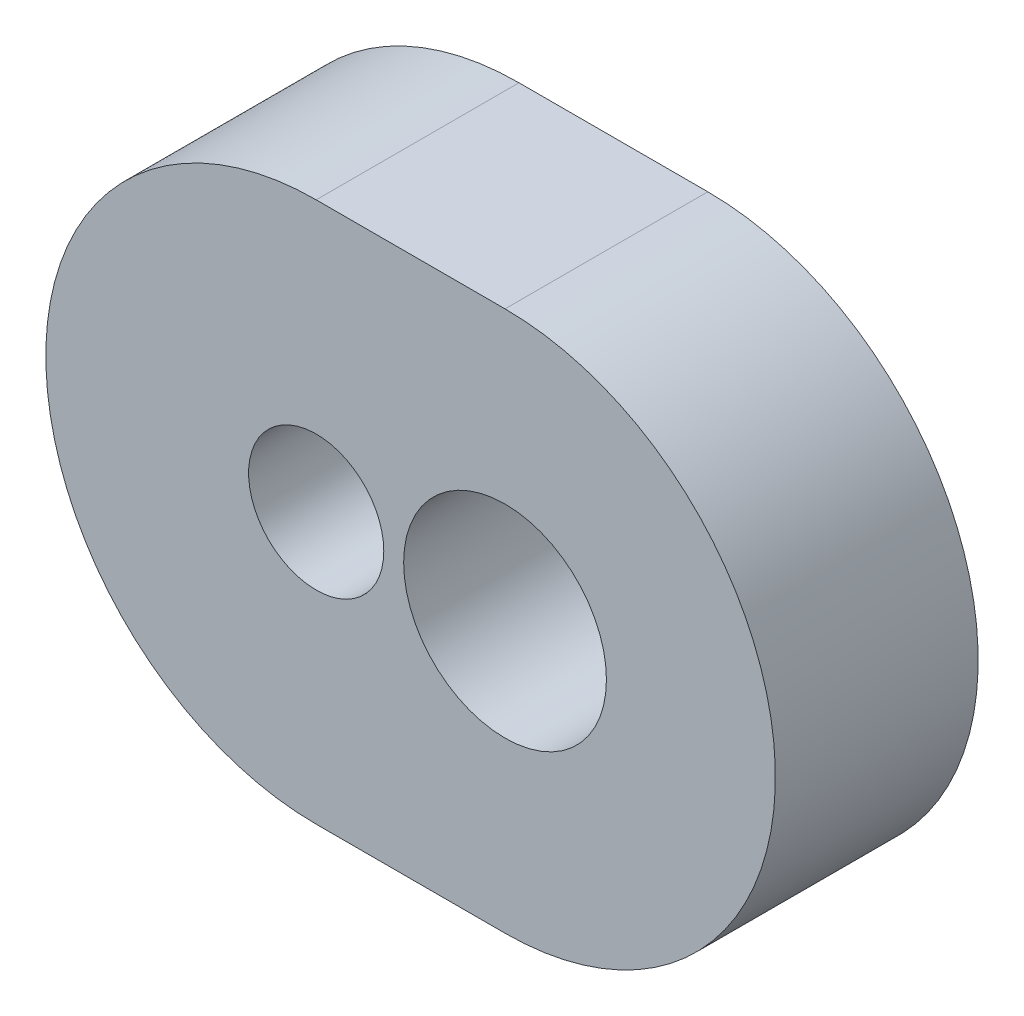
ISO-10303-21;
HEADER;
FILE_DESCRIPTION(('STEP AP214'),'2;1');
FILE_NAME('part.step','',(''),(''),'','','');
FILE_SCHEMA(('AUTOMOTIVE_DESIGN { 1 0 10303 214 1 1 1 1 }'));
ENDSEC;
DATA;
#1=APPLICATION_CONTEXT('core data for automotive mechanical design processes');
#2=APPLICATION_PROTOCOL_DEFINITION('international standard','automotive_design',2000,#1);
#3=PRODUCT_CONTEXT('',#1,'mechanical');
#4=PRODUCT('Part','Part','',(#3));
#5=PRODUCT_RELATED_PRODUCT_CATEGORY('part','',(#4));
#6=PRODUCT_DEFINITION_FORMATION('','',#4);
#7=PRODUCT_DEFINITION_CONTEXT('part definition',#1,'design');
#8=PRODUCT_DEFINITION('design','',#6,#7);
#9=PRODUCT_DEFINITION_SHAPE('','',#8);
#10=(LENGTH_UNIT() NAMED_UNIT(*) SI_UNIT(.MILLI.,.METRE.));
#11=(NAMED_UNIT(*) PLANE_ANGLE_UNIT() SI_UNIT($,.RADIAN.));
#12=(NAMED_UNIT(*) SI_UNIT($,.STERADIAN.) SOLID_ANGLE_UNIT());
#13=UNCERTAINTY_MEASURE_WITH_UNIT(LENGTH_MEASURE(1.E-05),#10,'distance_accuracy_value','');
#14=(GEOMETRIC_REPRESENTATION_CONTEXT(3) GLOBAL_UNCERTAINTY_ASSIGNED_CONTEXT((#13)) GLOBAL_UNIT_ASSIGNED_CONTEXT((#10,
#11,#12)) REPRESENTATION_CONTEXT('',''));
#15=CARTESIAN_POINT('',(0.,0.,0.));
#16=DIRECTION('',(0.,0.,1.));
#17=DIRECTION('',(1.,0.,0.));
#18=AXIS2_PLACEMENT_3D('',#15,#16,#17);
#19=CARTESIAN_POINT('',(0.,0.,3.));
#20=DIRECTION('',(0.,0.,-1.));
#21=DIRECTION('',(-1.,0.,0.));
#22=AXIS2_PLACEMENT_3D('',#19,#20,#21);
#23=PLANE('',#22);
#24=CARTESIAN_POINT('',(0.,0.,3.));
#25=DIRECTION('',(0.,0.,1.));
#26=DIRECTION('',(-1.,0.,0.));
#27=AXIS2_PLACEMENT_3D('',#24,#25,#26);
#28=CIRCLE('',#27,4.);
#29=CARTESIAN_POINT('',(0.,-4.,3.));
#30=VERTEX_POINT('',#29);
#31=CARTESIAN_POINT('',(0.,4.,3.));
#32=VERTEX_POINT('',#31);
#33=EDGE_CURVE('E93',#30,#32,#28,.T.);
#34=ORIENTED_EDGE('',*,*,#33,.T.);
#35=DIRECTION('',(-1.,0.,0.));
#36=VECTOR('',#35,1.);
#37=CARTESIAN_POINT('',(-2.794,4.,3.));
#38=LINE('',#37,#36);
#39=CARTESIAN_POINT('',(-2.794,4.,3.));
#40=VERTEX_POINT('',#39);
#41=EDGE_CURVE('E88',#32,#40,#38,.T.);
#42=ORIENTED_EDGE('',*,*,#41,.T.);
#43=CARTESIAN_POINT('',(-2.794,0.,3.));
#44=DIRECTION('',(0.,0.,1.));
#45=DIRECTION('',(1.,0.,0.));
#46=AXIS2_PLACEMENT_3D('',#43,#44,#45);
#47=CIRCLE('',#46,4.);
#48=CARTESIAN_POINT('',(-2.794,-4.,3.));
#49=VERTEX_POINT('',#48);
#50=EDGE_CURVE('E90',#40,#49,#47,.T.);
#51=ORIENTED_EDGE('',*,*,#50,.T.);
#52=DIRECTION('',(1.,0.,0.));
#53=VECTOR('',#52,1.);
#54=CARTESIAN_POINT('',(-2.794,-4.,3.));
#55=LINE('',#54,#53);
#56=EDGE_CURVE('E57',#49,#30,#55,.T.);
#57=ORIENTED_EDGE('',*,*,#56,.T.);
#58=EDGE_LOOP('',(#34,#42,#51,#57));
#59=FACE_BOUND('',#58,.T.);
#60=CARTESIAN_POINT('',(-2.794,0.,3.));
#61=DIRECTION('',(0.,0.,1.));
#62=DIRECTION('',(1.,0.,0.));
#63=AXIS2_PLACEMENT_3D('',#60,#61,#62);
#64=CIRCLE('',#63,1.);
#65=CARTESIAN_POINT('',(-1.794,0.,3.));
#66=VERTEX_POINT('',#65);
#67=EDGE_CURVE('E106',#66,#66,#64,.T.);
#68=ORIENTED_EDGE('',*,*,#67,.F.);
#69=EDGE_LOOP('',(#68));
#70=FACE_BOUND('',#69,.T.);
#71=CARTESIAN_POINT('',(0.,0.,3.));
#72=DIRECTION('',(0.,0.,1.));
#73=DIRECTION('',(1.,0.,0.));
#74=AXIS2_PLACEMENT_3D('',#71,#72,#73);
#75=CIRCLE('',#74,1.5);
#76=CARTESIAN_POINT('',(1.50000000000001,0.,3.));
#77=VERTEX_POINT('',#76);
#78=EDGE_CURVE('E123',#77,#77,#75,.T.);
#79=ORIENTED_EDGE('',*,*,#78,.F.);
#80=EDGE_LOOP('',(#79));
#81=FACE_BOUND('',#80,.T.);
#82=ADVANCED_FACE('F39',(#59,#70,#81),#23,.F.);
#83=CARTESIAN_POINT('',(0.,0.,0.));
#84=DIRECTION('',(0.,0.,-1.));
#85=DIRECTION('',(-1.,0.,0.));
#86=AXIS2_PLACEMENT_3D('',#83,#84,#85);
#87=PLANE('',#86);
#88=CARTESIAN_POINT('',(-2.794,0.,0.));
#89=DIRECTION('',(0.,0.,1.));
#90=DIRECTION('',(1.,0.,0.));
#91=AXIS2_PLACEMENT_3D('',#88,#89,#90);
#92=CIRCLE('',#91,1.);
#93=CARTESIAN_POINT('',(-1.794,0.,0.));
#94=VERTEX_POINT('',#93);
#95=EDGE_CURVE('E117',#94,#94,#92,.T.);
#96=ORIENTED_EDGE('',*,*,#95,.T.);
#97=EDGE_LOOP('',(#96));
#98=FACE_BOUND('',#97,.T.);
#99=CARTESIAN_POINT('',(0.,0.,0.));
#100=DIRECTION('',(0.,0.,1.));
#101=DIRECTION('',(-1.,0.,0.));
#102=AXIS2_PLACEMENT_3D('',#99,#100,#101);
#103=CIRCLE('',#102,4.);
#104=CARTESIAN_POINT('',(0.,-4.,0.));
#105=VERTEX_POINT('',#104);
#106=CARTESIAN_POINT('',(0.,4.,0.));
#107=VERTEX_POINT('',#106);
#108=EDGE_CURVE('E103',#105,#107,#103,.T.);
#109=ORIENTED_EDGE('',*,*,#108,.F.);
#110=DIRECTION('',(1.,0.,0.));
#111=VECTOR('',#110,1.);
#112=CARTESIAN_POINT('',(-2.794,-4.,0.));
#113=LINE('',#112,#111);
#114=CARTESIAN_POINT('',(-2.794,-4.,0.));
#115=VERTEX_POINT('',#114);
#116=EDGE_CURVE('E80',#115,#105,#113,.T.);
#117=ORIENTED_EDGE('',*,*,#116,.F.);
#118=CARTESIAN_POINT('',(-2.794,0.,0.));
#119=DIRECTION('',(0.,0.,1.));
#120=DIRECTION('',(1.,0.,0.));
#121=AXIS2_PLACEMENT_3D('',#118,#119,#120);
#122=CIRCLE('',#121,4.);
#123=CARTESIAN_POINT('',(-2.794,4.,0.));
#124=VERTEX_POINT('',#123);
#125=EDGE_CURVE('E71',#124,#115,#122,.T.);
#126=ORIENTED_EDGE('',*,*,#125,.F.);
#127=DIRECTION('',(-1.,0.,0.));
#128=VECTOR('',#127,1.);
#129=CARTESIAN_POINT('',(-2.794,4.,0.));
#130=LINE('',#129,#128);
#131=EDGE_CURVE('E92',#107,#124,#130,.T.);
#132=ORIENTED_EDGE('',*,*,#131,.F.);
#133=EDGE_LOOP('',(#109,#117,#126,#132));
#134=FACE_BOUND('',#133,.T.);
#135=CARTESIAN_POINT('',(0.,0.,0.));
#136=DIRECTION('',(0.,0.,1.));
#137=DIRECTION('',(1.,0.,0.));
#138=AXIS2_PLACEMENT_3D('',#135,#136,#137);
#139=CIRCLE('',#138,1.5);
#140=CARTESIAN_POINT('',(1.50000000000001,0.,0.));
#141=VERTEX_POINT('',#140);
#142=EDGE_CURVE('E122',#141,#141,#139,.T.);
#143=ORIENTED_EDGE('',*,*,#142,.T.);
#144=EDGE_LOOP('',(#143));
#145=FACE_BOUND('',#144,.T.);
#146=ADVANCED_FACE('F111',(#98,#134,#145),#87,.T.);
#147=CARTESIAN_POINT('',(0.,0.,3.));
#148=DIRECTION('',(0.,0.,-1.));
#149=DIRECTION('',(-1.,0.,0.));
#150=AXIS2_PLACEMENT_3D('',#147,#148,#149);
#151=CYLINDRICAL_SURFACE('',#150,4.);
#152=ORIENTED_EDGE('',*,*,#108,.T.);
#153=DIRECTION('',(0.,0.,-1.));
#154=VECTOR('',#153,1.);
#155=CARTESIAN_POINT('',(0.,4.,3.));
#156=LINE('',#155,#154);
#157=EDGE_CURVE('E11',#32,#107,#156,.T.);
#158=ORIENTED_EDGE('',*,*,#157,.F.);
#159=ORIENTED_EDGE('',*,*,#33,.F.);
#160=DIRECTION('',(0.,0.,-1.));
#161=VECTOR('',#160,1.);
#162=CARTESIAN_POINT('',(0.,-4.,3.));
#163=LINE('',#162,#161);
#164=EDGE_CURVE('E97',#30,#105,#163,.T.);
#165=ORIENTED_EDGE('',*,*,#164,.T.);
#166=EDGE_LOOP('',(#152,#158,#159,#165));
#167=FACE_BOUND('',#166,.T.);
#168=ADVANCED_FACE('F41',(#167),#151,.T.);
#169=CARTESIAN_POINT('',(-2.794,4.,3.));
#170=DIRECTION('',(0.,-1.,0.));
#171=DIRECTION('',(0.,0.,-1.));
#172=AXIS2_PLACEMENT_3D('',#169,#170,#171);
#173=PLANE('',#172);
#174=ORIENTED_EDGE('',*,*,#131,.T.);
#175=DIRECTION('',(0.,0.,-1.));
#176=VECTOR('',#175,1.);
#177=CARTESIAN_POINT('',(-2.794,4.,3.));
#178=LINE('',#177,#176);
#179=EDGE_CURVE('E48',#40,#124,#178,.T.);
#180=ORIENTED_EDGE('',*,*,#179,.F.);
#181=ORIENTED_EDGE('',*,*,#41,.F.);
#182=ORIENTED_EDGE('',*,*,#157,.T.);
#183=EDGE_LOOP('',(#174,#180,#181,#182));
#184=FACE_BOUND('',#183,.T.);
#185=ADVANCED_FACE('F94',(#184),#173,.F.);
#186=CARTESIAN_POINT('',(-2.794,0.,3.));
#187=DIRECTION('',(0.,0.,-1.));
#188=DIRECTION('',(-1.,0.,0.));
#189=AXIS2_PLACEMENT_3D('',#186,#187,#188);
#190=CYLINDRICAL_SURFACE('',#189,4.);
#191=ORIENTED_EDGE('',*,*,#125,.T.);
#192=DIRECTION('',(0.,0.,-1.));
#193=VECTOR('',#192,1.);
#194=CARTESIAN_POINT('',(-2.794,-4.,3.));
#195=LINE('',#194,#193);
#196=EDGE_CURVE('E96',#49,#115,#195,.T.);
#197=ORIENTED_EDGE('',*,*,#196,.F.);
#198=ORIENTED_EDGE('',*,*,#50,.F.);
#199=ORIENTED_EDGE('',*,*,#179,.T.);
#200=EDGE_LOOP('',(#191,#197,#198,#199));
#201=FACE_BOUND('',#200,.T.);
#202=ADVANCED_FACE('F100',(#201),#190,.T.);
#203=CARTESIAN_POINT('',(-2.794,-4.,3.));
#204=DIRECTION('',(0.,1.,0.));
#205=DIRECTION('',(0.,0.,1.));
#206=AXIS2_PLACEMENT_3D('',#203,#204,#205);
#207=PLANE('',#206);
#208=ORIENTED_EDGE('',*,*,#116,.T.);
#209=ORIENTED_EDGE('',*,*,#164,.F.);
#210=ORIENTED_EDGE('',*,*,#56,.F.);
#211=ORIENTED_EDGE('',*,*,#196,.T.);
#212=EDGE_LOOP('',(#208,#209,#210,#211));
#213=FACE_BOUND('',#212,.T.);
#214=ADVANCED_FACE('F112',(#213),#207,.F.);
#215=CARTESIAN_POINT('',(-2.794,0.,3.));
#216=DIRECTION('',(0.,0.,-1.));
#217=DIRECTION('',(-1.,0.,0.));
#218=AXIS2_PLACEMENT_3D('',#215,#216,#217);
#219=CYLINDRICAL_SURFACE('',#218,1.);
#220=ORIENTED_EDGE('',*,*,#67,.T.);
#221=EDGE_LOOP('',(#220));
#222=FACE_BOUND('',#221,.T.);
#223=ORIENTED_EDGE('',*,*,#95,.F.);
#224=EDGE_LOOP('',(#223));
#225=FACE_BOUND('',#224,.T.);
#226=ADVANCED_FACE('F143',(#222,#225),#219,.F.);
#227=CARTESIAN_POINT('',(0.,0.,3.));
#228=DIRECTION('',(0.,0.,-1.));
#229=DIRECTION('',(-1.,0.,0.));
#230=AXIS2_PLACEMENT_3D('',#227,#228,#229);
#231=CYLINDRICAL_SURFACE('',#230,1.5);
#232=ORIENTED_EDGE('',*,*,#78,.T.);
#233=EDGE_LOOP('',(#232));
#234=FACE_BOUND('',#233,.T.);
#235=ORIENTED_EDGE('',*,*,#142,.F.);
#236=EDGE_LOOP('',(#235));
#237=FACE_BOUND('',#236,.T.);
#238=ADVANCED_FACE('F128',(#234,#237),#231,.F.);
#239=CLOSED_SHELL('',(#82,#146,#168,#185,#202,#214,#226,#238));
#240=MANIFOLD_SOLID_BREP('B2',#239);
#241=ADVANCED_BREP_SHAPE_REPRESENTATION('',(#18,#240),#14);
#242=SHAPE_DEFINITION_REPRESENTATION(#9,#241);
ENDSEC;
END-ISO-10303-21;
